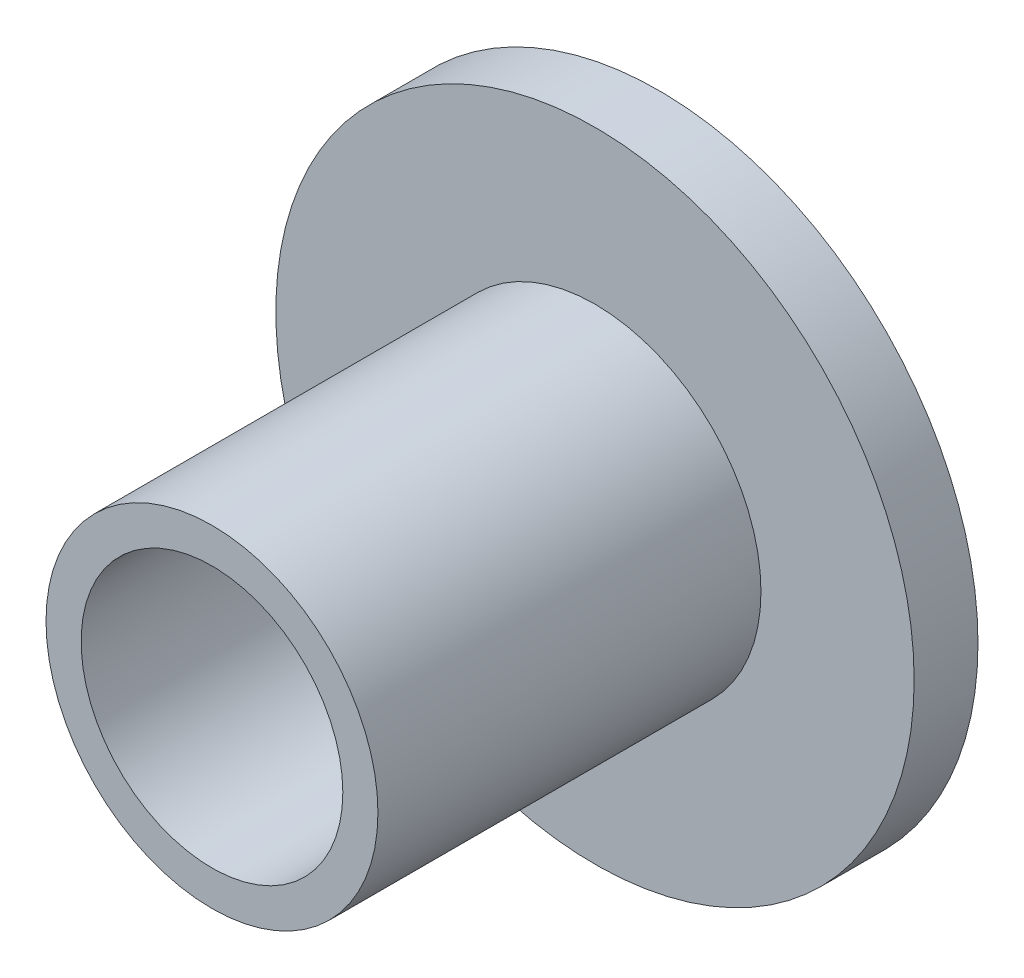
ISO-10303-21;
HEADER;
FILE_DESCRIPTION(('STEP AP214'),'2;1');
FILE_NAME('part.step','',(''),(''),'','','');
FILE_SCHEMA(('AUTOMOTIVE_DESIGN { 1 0 10303 214 1 1 1 1 }'));
ENDSEC;
DATA;
#1=APPLICATION_CONTEXT('core data for automotive mechanical design processes');
#2=APPLICATION_PROTOCOL_DEFINITION('international standard','automotive_design',2000,#1);
#3=PRODUCT_CONTEXT('',#1,'mechanical');
#4=PRODUCT('Part','Part','',(#3));
#5=PRODUCT_RELATED_PRODUCT_CATEGORY('part','',(#4));
#6=PRODUCT_DEFINITION_FORMATION('','',#4);
#7=PRODUCT_DEFINITION_CONTEXT('part definition',#1,'design');
#8=PRODUCT_DEFINITION('design','',#6,#7);
#9=PRODUCT_DEFINITION_SHAPE('','',#8);
#10=(LENGTH_UNIT() NAMED_UNIT(*) SI_UNIT(.MILLI.,.METRE.));
#11=(NAMED_UNIT(*) PLANE_ANGLE_UNIT() SI_UNIT($,.RADIAN.));
#12=(NAMED_UNIT(*) SI_UNIT($,.STERADIAN.) SOLID_ANGLE_UNIT());
#13=UNCERTAINTY_MEASURE_WITH_UNIT(LENGTH_MEASURE(1.E-05),#10,'distance_accuracy_value','');
#14=(GEOMETRIC_REPRESENTATION_CONTEXT(3) GLOBAL_UNCERTAINTY_ASSIGNED_CONTEXT((#13)) GLOBAL_UNIT_ASSIGNED_CONTEXT((#10,
#11,#12)) REPRESENTATION_CONTEXT('',''));
#15=CARTESIAN_POINT('',(0.,0.,0.));
#16=DIRECTION('',(0.,0.,1.));
#17=DIRECTION('',(1.,0.,0.));
#18=AXIS2_PLACEMENT_3D('',#15,#16,#17);
#19=CARTESIAN_POINT('',(0.,0.,5.));
#20=DIRECTION('',(0.,0.,-1.));
#21=DIRECTION('',(-1.,0.,0.));
#22=AXIS2_PLACEMENT_3D('',#19,#20,#21);
#23=CYLINDRICAL_SURFACE('',#22,25.);
#24=CARTESIAN_POINT('',(0.,0.,5.));
#25=DIRECTION('',(0.,0.,1.));
#26=DIRECTION('',(1.,0.,0.));
#27=AXIS2_PLACEMENT_3D('',#24,#25,#26);
#28=CIRCLE('',#27,25.);
#29=CARTESIAN_POINT('',(25.,0.,5.));
#30=VERTEX_POINT('',#29);
#31=EDGE_CURVE('E37',#30,#30,#28,.T.);
#32=ORIENTED_EDGE('',*,*,#31,.F.);
#33=EDGE_LOOP('',(#32));
#34=FACE_BOUND('',#33,.T.);
#35=CARTESIAN_POINT('',(0.,0.,0.));
#36=DIRECTION('',(0.,0.,1.));
#37=DIRECTION('',(1.,0.,0.));
#38=AXIS2_PLACEMENT_3D('',#35,#36,#37);
#39=CIRCLE('',#38,25.);
#40=CARTESIAN_POINT('',(25.,0.,0.));
#41=VERTEX_POINT('',#40);
#42=EDGE_CURVE('E41',#41,#41,#39,.T.);
#43=ORIENTED_EDGE('',*,*,#42,.T.);
#44=EDGE_LOOP('',(#43));
#45=FACE_BOUND('',#44,.T.);
#46=ADVANCED_FACE('F31',(#34,#45),#23,.T.);
#47=CARTESIAN_POINT('',(0.,0.,5.));
#48=DIRECTION('',(0.,0.,1.));
#49=DIRECTION('',(1.,0.,0.));
#50=AXIS2_PLACEMENT_3D('',#47,#48,#49);
#51=PLANE('',#50);
#52=CARTESIAN_POINT('',(0.,0.,5.));
#53=DIRECTION('',(0.,0.,1.));
#54=DIRECTION('',(1.,0.,0.));
#55=AXIS2_PLACEMENT_3D('',#52,#53,#54);
#56=CIRCLE('',#55,13.);
#57=CARTESIAN_POINT('',(13.,0.,5.));
#58=VERTEX_POINT('',#57);
#59=EDGE_CURVE('E48',#58,#58,#56,.T.);
#60=ORIENTED_EDGE('',*,*,#59,.F.);
#61=EDGE_LOOP('',(#60));
#62=FACE_BOUND('',#61,.T.);
#63=ORIENTED_EDGE('',*,*,#31,.T.);
#64=EDGE_LOOP('',(#63));
#65=FACE_BOUND('',#64,.T.);
#66=ADVANCED_FACE('F71',(#62,#65),#51,.T.);
#67=CARTESIAN_POINT('',(0.,0.,0.));
#68=DIRECTION('',(0.,0.,1.));
#69=DIRECTION('',(1.,0.,0.));
#70=AXIS2_PLACEMENT_3D('',#67,#68,#69);
#71=PLANE('',#70);
#72=ORIENTED_EDGE('',*,*,#42,.F.);
#73=EDGE_LOOP('',(#72));
#74=FACE_BOUND('',#73,.T.);
#75=ADVANCED_FACE('F62',(#74),#71,.F.);
#76=CARTESIAN_POINT('',(0.,0.,35.));
#77=DIRECTION('',(0.,0.,1.));
#78=DIRECTION('',(1.,0.,0.));
#79=AXIS2_PLACEMENT_3D('',#76,#77,#78);
#80=PLANE('',#79);
#81=CARTESIAN_POINT('',(0.,0.,35.));
#82=DIRECTION('',(0.,0.,1.));
#83=DIRECTION('',(1.,0.,0.));
#84=AXIS2_PLACEMENT_3D('',#81,#82,#83);
#85=CIRCLE('',#84,13.);
#86=CARTESIAN_POINT('',(13.,0.,35.));
#87=VERTEX_POINT('',#86);
#88=EDGE_CURVE('E46',#87,#87,#85,.T.);
#89=ORIENTED_EDGE('',*,*,#88,.T.);
#90=EDGE_LOOP('',(#89));
#91=FACE_BOUND('',#90,.T.);
#92=CARTESIAN_POINT('',(0.,0.,35.));
#93=DIRECTION('',(0.,0.,1.));
#94=DIRECTION('',(1.,0.,0.));
#95=AXIS2_PLACEMENT_3D('',#92,#93,#94);
#96=CIRCLE('',#95,10.25);
#97=CARTESIAN_POINT('',(10.25,0.,35.));
#98=VERTEX_POINT('',#97);
#99=EDGE_CURVE('E51',#98,#98,#96,.T.);
#100=ORIENTED_EDGE('',*,*,#99,.F.);
#101=EDGE_LOOP('',(#100));
#102=FACE_BOUND('',#101,.T.);
#103=ADVANCED_FACE('F59',(#91,#102),#80,.T.);
#104=CARTESIAN_POINT('',(0.,0.,35.));
#105=DIRECTION('',(0.,0.,-1.));
#106=DIRECTION('',(-1.,0.,0.));
#107=AXIS2_PLACEMENT_3D('',#104,#105,#106);
#108=CYLINDRICAL_SURFACE('',#107,13.);
#109=ORIENTED_EDGE('',*,*,#88,.F.);
#110=EDGE_LOOP('',(#109));
#111=FACE_BOUND('',#110,.T.);
#112=ORIENTED_EDGE('',*,*,#59,.T.);
#113=EDGE_LOOP('',(#112));
#114=FACE_BOUND('',#113,.T.);
#115=ADVANCED_FACE('F61',(#111,#114),#108,.T.);
#116=CARTESIAN_POINT('',(0.,0.,35.));
#117=DIRECTION('',(0.,0.,-1.));
#118=DIRECTION('',(-1.,0.,0.));
#119=AXIS2_PLACEMENT_3D('',#116,#117,#118);
#120=CYLINDRICAL_SURFACE('',#119,10.25);
#121=ORIENTED_EDGE('',*,*,#99,.T.);
#122=EDGE_LOOP('',(#121));
#123=FACE_BOUND('',#122,.T.);
#124=CARTESIAN_POINT('',(0.,0.,5.));
#125=DIRECTION('',(0.,0.,1.));
#126=DIRECTION('',(1.,0.,0.));
#127=AXIS2_PLACEMENT_3D('',#124,#125,#126);
#128=CIRCLE('',#127,10.25);
#129=CARTESIAN_POINT('',(10.25,0.,5.));
#130=VERTEX_POINT('',#129);
#131=EDGE_CURVE('E10',#130,#130,#128,.F.);
#132=ORIENTED_EDGE('',*,*,#131,.T.);
#133=EDGE_LOOP('',(#132));
#134=FACE_BOUND('',#133,.T.);
#135=ADVANCED_FACE('F57',(#123,#134),#120,.F.);
#136=ORIENTED_EDGE('',*,*,#131,.F.);
#137=EDGE_LOOP('',(#136));
#138=FACE_BOUND('',#137,.T.);
#139=ADVANCED_FACE('F81',(#138),#51,.T.);
#140=CLOSED_SHELL('',(#46,#66,#75,#103,#115,#135,#139));
#141=MANIFOLD_SOLID_BREP('B2',#140);
#142=ADVANCED_BREP_SHAPE_REPRESENTATION('',(#18,#141),#14);
#143=SHAPE_DEFINITION_REPRESENTATION(#9,#142);
ENDSEC;
END-ISO-10303-21;
